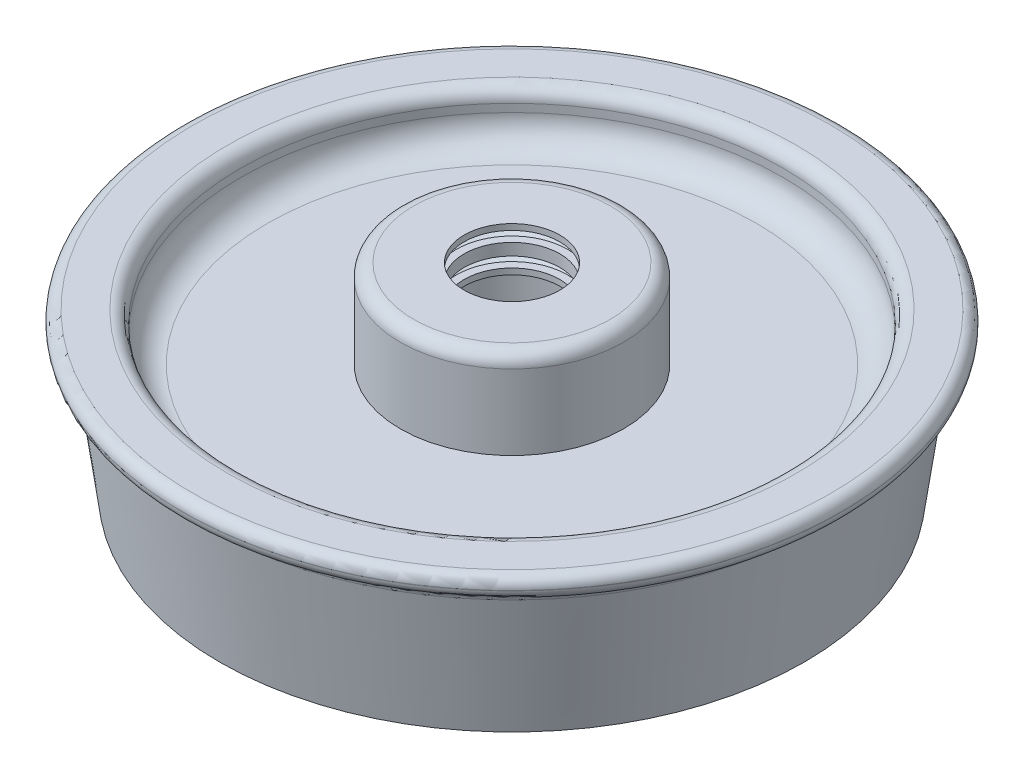
ISO-10303-21;
HEADER;
FILE_DESCRIPTION(('STEP AP214'),'2;1');
FILE_NAME('part.step','',(''),(''),'','','');
FILE_SCHEMA(('AUTOMOTIVE_DESIGN { 1 0 10303 214 1 1 1 1 }'));
ENDSEC;
DATA;
#1=APPLICATION_CONTEXT('core data for automotive mechanical design processes');
#2=APPLICATION_PROTOCOL_DEFINITION('international standard','automotive_design',2000,#1);
#3=PRODUCT_CONTEXT('',#1,'mechanical');
#4=PRODUCT('Part','Part','',(#3));
#5=PRODUCT_RELATED_PRODUCT_CATEGORY('part','',(#4));
#6=PRODUCT_DEFINITION_FORMATION('','',#4);
#7=PRODUCT_DEFINITION_CONTEXT('part definition',#1,'design');
#8=PRODUCT_DEFINITION('design','',#6,#7);
#9=PRODUCT_DEFINITION_SHAPE('','',#8);
#10=(LENGTH_UNIT() NAMED_UNIT(*) SI_UNIT(.MILLI.,.METRE.));
#11=(NAMED_UNIT(*) PLANE_ANGLE_UNIT() SI_UNIT($,.RADIAN.));
#12=(NAMED_UNIT(*) SI_UNIT($,.STERADIAN.) SOLID_ANGLE_UNIT());
#13=UNCERTAINTY_MEASURE_WITH_UNIT(LENGTH_MEASURE(1.E-05),#10,'distance_accuracy_value','');
#14=(GEOMETRIC_REPRESENTATION_CONTEXT(3) GLOBAL_UNCERTAINTY_ASSIGNED_CONTEXT((#13)) GLOBAL_UNIT_ASSIGNED_CONTEXT((#10,
#11,#12)) REPRESENTATION_CONTEXT('',''));
#15=CARTESIAN_POINT('',(0.,0.,0.));
#16=DIRECTION('',(0.,0.,1.));
#17=DIRECTION('',(1.,0.,0.));
#18=AXIS2_PLACEMENT_3D('',#15,#16,#17);
#19=CARTESIAN_POINT('',(-2.99999999999907,34.,-88.8994605039951));
#20=DIRECTION('',(0.,1.,0.));
#21=DIRECTION('',(1.,0.,0.));
#22=AXIS2_PLACEMENT_3D('',#19,#20,#21);
#23=PLANE('',#22);
#24=DIRECTION('',(1.,0.,0.));
#25=VECTOR('',#24,1.);
#26=CARTESIAN_POINT('',(-2.99999999999956,34.,-42.));
#27=LINE('',#26,#25);
#28=CARTESIAN_POINT('',(-2.99999999999956,34.,-42.));
#29=VERTEX_POINT('',#28);
#30=CARTESIAN_POINT('',(3.00000000000044,34.,-42.));
#31=VERTEX_POINT('',#30);
#32=EDGE_CURVE('E55',#29,#31,#27,.T.);
#33=ORIENTED_EDGE('',*,*,#32,.T.);
#34=DIRECTION('',(0.,0.,1.));
#35=VECTOR('',#34,1.);
#36=CARTESIAN_POINT('',(3.00000000000093,34.,-88.8994605039951));
#37=LINE('',#36,#35);
#38=CARTESIAN_POINT('',(3.00000000000093,34.,-88.8994605039951));
#39=VERTEX_POINT('',#38);
#40=EDGE_CURVE('E86',#39,#31,#37,.T.);
#41=ORIENTED_EDGE('',*,*,#40,.F.);
#42=DIRECTION('',(1.,0.,0.));
#43=VECTOR('',#42,1.);
#44=CARTESIAN_POINT('',(-2.99999999999907,34.,-88.8994605039951));
#45=LINE('',#44,#43);
#46=CARTESIAN_POINT('',(-2.99999999999907,34.,-88.8994605039951));
#47=VERTEX_POINT('',#46);
#48=EDGE_CURVE('E12',#47,#39,#45,.T.);
#49=ORIENTED_EDGE('',*,*,#48,.F.);
#50=DIRECTION('',(0.,0.,1.));
#51=VECTOR('',#50,1.);
#52=CARTESIAN_POINT('',(-2.99999999999907,34.,-88.8994605039951));
#53=LINE('',#52,#51);
#54=EDGE_CURVE('E87',#47,#29,#53,.T.);
#55=ORIENTED_EDGE('',*,*,#54,.T.);
#56=EDGE_LOOP('',(#33,#41,#49,#55));
#57=FACE_BOUND('',#56,.T.);
#58=ADVANCED_FACE('F52',(#57),#23,.T.);
#59=CARTESIAN_POINT('',(-2.99999999999956,24.,-42.));
#60=DIRECTION('',(0.,-0.978015034919325,-0.208534389182582));
#61=DIRECTION('',(0.,0.208534389182582,-0.978015034919325));
#62=AXIS2_PLACEMENT_3D('',#59,#60,#61);
#63=PLANE('',#62);
#64=ORIENTED_EDGE('',*,*,#48,.T.);
#65=DIRECTION('',(0.,0.208534389182582,-0.978015034919324));
#66=VECTOR('',#65,1.);
#67=CARTESIAN_POINT('',(3.00000000000044,24.,-42.));
#68=LINE('',#67,#66);
#69=CARTESIAN_POINT('',(3.00000000000044,24.,-42.));
#70=VERTEX_POINT('',#69);
#71=EDGE_CURVE('E96',#70,#39,#68,.T.);
#72=ORIENTED_EDGE('',*,*,#71,.F.);
#73=DIRECTION('',(1.,0.,0.));
#74=VECTOR('',#73,1.);
#75=CARTESIAN_POINT('',(-2.99999999999956,24.,-42.));
#76=LINE('',#75,#74);
#77=CARTESIAN_POINT('',(-2.99999999999956,24.,-42.));
#78=VERTEX_POINT('',#77);
#79=EDGE_CURVE('E60',#78,#70,#76,.T.);
#80=ORIENTED_EDGE('',*,*,#79,.F.);
#81=DIRECTION('',(0.,0.208534389182582,-0.978015034919324));
#82=VECTOR('',#81,1.);
#83=CARTESIAN_POINT('',(-2.99999999999956,24.,-42.));
#84=LINE('',#83,#82);
#85=EDGE_CURVE('E90',#78,#47,#84,.T.);
#86=ORIENTED_EDGE('',*,*,#85,.T.);
#87=EDGE_LOOP('',(#64,#72,#80,#86));
#88=FACE_BOUND('',#87,.T.);
#89=ADVANCED_FACE('F106',(#88),#63,.T.);
#90=CARTESIAN_POINT('',(-2.99999999999956,34.,-42.));
#91=DIRECTION('',(0.,0.,1.));
#92=DIRECTION('',(1.,0.,0.));
#93=AXIS2_PLACEMENT_3D('',#90,#91,#92);
#94=PLANE('',#93);
#95=ORIENTED_EDGE('',*,*,#79,.T.);
#96=DIRECTION('',(0.,-1.,0.));
#97=VECTOR('',#96,1.);
#98=CARTESIAN_POINT('',(3.00000000000044,34.,-42.));
#99=LINE('',#98,#97);
#100=EDGE_CURVE('E92',#31,#70,#99,.T.);
#101=ORIENTED_EDGE('',*,*,#100,.F.);
#102=ORIENTED_EDGE('',*,*,#32,.F.);
#103=DIRECTION('',(0.,-1.,0.));
#104=VECTOR('',#103,1.);
#105=CARTESIAN_POINT('',(-2.99999999999956,34.,-42.));
#106=LINE('',#105,#104);
#107=EDGE_CURVE('E103',#29,#78,#106,.T.);
#108=ORIENTED_EDGE('',*,*,#107,.T.);
#109=EDGE_LOOP('',(#95,#101,#102,#108));
#110=FACE_BOUND('',#109,.T.);
#111=ADVANCED_FACE('F93',(#110),#94,.T.);
#112=CARTESIAN_POINT('',(-3.,0.,0.));
#113=DIRECTION('',(1.,0.,0.));
#114=DIRECTION('',(0.,0.,-1.));
#115=AXIS2_PLACEMENT_3D('',#112,#113,#114);
#116=PLANE('',#115);
#117=ORIENTED_EDGE('',*,*,#54,.F.);
#118=ORIENTED_EDGE('',*,*,#85,.F.);
#119=ORIENTED_EDGE('',*,*,#107,.F.);
#120=EDGE_LOOP('',(#117,#118,#119));
#121=FACE_BOUND('',#120,.T.);
#122=ADVANCED_FACE('F108',(#121),#116,.F.);
#123=CARTESIAN_POINT('',(3.,0.,0.));
#124=DIRECTION('',(1.,0.,0.));
#125=DIRECTION('',(0.,0.,-1.));
#126=AXIS2_PLACEMENT_3D('',#123,#124,#125);
#127=PLANE('',#126);
#128=ORIENTED_EDGE('',*,*,#40,.T.);
#129=ORIENTED_EDGE('',*,*,#100,.T.);
#130=ORIENTED_EDGE('',*,*,#71,.T.);
#131=EDGE_LOOP('',(#128,#129,#130));
#132=FACE_BOUND('',#131,.T.);
#133=ADVANCED_FACE('F98',(#132),#127,.T.);
#134=CLOSED_SHELL('',(#58,#89,#111,#122,#133));
#135=MANIFOLD_SOLID_BREP('B2',#134);
#136=CARTESIAN_POINT('',(-88.8994605039951,34.,3.));
#137=DIRECTION('',(0.,1.,0.));
#138=DIRECTION('',(0.,0.,-1.));
#139=AXIS2_PLACEMENT_3D('',#136,#137,#138);
#140=PLANE('',#139);
#141=DIRECTION('',(0.,0.,-1.));
#142=VECTOR('',#141,1.);
#143=CARTESIAN_POINT('',(-42.,34.,3.));
#144=LINE('',#143,#142);
#145=CARTESIAN_POINT('',(-42.,34.,3.));
#146=VERTEX_POINT('',#145);
#147=CARTESIAN_POINT('',(-42.,34.,-3.));
#148=VERTEX_POINT('',#147);
#149=EDGE_CURVE('E163',#146,#148,#144,.T.);
#150=ORIENTED_EDGE('',*,*,#149,.T.);
#151=DIRECTION('',(1.,0.,0.));
#152=VECTOR('',#151,1.);
#153=CARTESIAN_POINT('',(-88.8994605039951,34.,-3.));
#154=LINE('',#153,#152);
#155=CARTESIAN_POINT('',(-88.8994605039951,34.,-3.));
#156=VERTEX_POINT('',#155);
#157=EDGE_CURVE('E194',#156,#148,#154,.T.);
#158=ORIENTED_EDGE('',*,*,#157,.F.);
#159=DIRECTION('',(0.,0.,-1.));
#160=VECTOR('',#159,1.);
#161=CARTESIAN_POINT('',(-88.8994605039951,34.,3.));
#162=LINE('',#161,#160);
#163=CARTESIAN_POINT('',(-88.8994605039951,34.,3.));
#164=VERTEX_POINT('',#163);
#165=EDGE_CURVE('E50',#164,#156,#162,.T.);
#166=ORIENTED_EDGE('',*,*,#165,.F.);
#167=DIRECTION('',(1.,0.,0.));
#168=VECTOR('',#167,1.);
#169=CARTESIAN_POINT('',(-88.8994605039951,34.,3.));
#170=LINE('',#169,#168);
#171=EDGE_CURVE('E195',#164,#146,#170,.T.);
#172=ORIENTED_EDGE('',*,*,#171,.T.);
#173=EDGE_LOOP('',(#150,#158,#166,#172));
#174=FACE_BOUND('',#173,.T.);
#175=ADVANCED_FACE('F160',(#174),#140,.T.);
#176=CARTESIAN_POINT('',(-42.,24.,3.));
#177=DIRECTION('',(-0.208534389182582,-0.978015034919325,0.));
#178=DIRECTION('',(-0.978015034919325,0.208534389182582,0.));
#179=AXIS2_PLACEMENT_3D('',#176,#177,#178);
#180=PLANE('',#179);
#181=ORIENTED_EDGE('',*,*,#165,.T.);
#182=DIRECTION('',(-0.978015034919324,0.208534389182582,0.));
#183=VECTOR('',#182,1.);
#184=CARTESIAN_POINT('',(-42.,24.,-3.));
#185=LINE('',#184,#183);
#186=CARTESIAN_POINT('',(-42.,24.,-3.));
#187=VERTEX_POINT('',#186);
#188=EDGE_CURVE('E204',#187,#156,#185,.T.);
#189=ORIENTED_EDGE('',*,*,#188,.F.);
#190=DIRECTION('',(0.,0.,-1.));
#191=VECTOR('',#190,1.);
#192=CARTESIAN_POINT('',(-42.,24.,3.));
#193=LINE('',#192,#191);
#194=CARTESIAN_POINT('',(-42.,24.,3.));
#195=VERTEX_POINT('',#194);
#196=EDGE_CURVE('E168',#195,#187,#193,.T.);
#197=ORIENTED_EDGE('',*,*,#196,.F.);
#198=DIRECTION('',(-0.978015034919324,0.208534389182582,0.));
#199=VECTOR('',#198,1.);
#200=CARTESIAN_POINT('',(-42.,24.,3.));
#201=LINE('',#200,#199);
#202=EDGE_CURVE('E198',#195,#164,#201,.T.);
#203=ORIENTED_EDGE('',*,*,#202,.T.);
#204=EDGE_LOOP('',(#181,#189,#197,#203));
#205=FACE_BOUND('',#204,.T.);
#206=ADVANCED_FACE('F214',(#205),#180,.T.);
#207=CARTESIAN_POINT('',(-42.,34.,3.));
#208=DIRECTION('',(1.,0.,0.));
#209=DIRECTION('',(0.,0.,-1.));
#210=AXIS2_PLACEMENT_3D('',#207,#208,#209);
#211=PLANE('',#210);
#212=ORIENTED_EDGE('',*,*,#196,.T.);
#213=DIRECTION('',(0.,-1.,0.));
#214=VECTOR('',#213,1.);
#215=CARTESIAN_POINT('',(-42.,34.,-3.));
#216=LINE('',#215,#214);
#217=EDGE_CURVE('E200',#148,#187,#216,.T.);
#218=ORIENTED_EDGE('',*,*,#217,.F.);
#219=ORIENTED_EDGE('',*,*,#149,.F.);
#220=DIRECTION('',(0.,-1.,0.));
#221=VECTOR('',#220,1.);
#222=CARTESIAN_POINT('',(-42.,34.,3.));
#223=LINE('',#222,#221);
#224=EDGE_CURVE('E211',#146,#195,#223,.T.);
#225=ORIENTED_EDGE('',*,*,#224,.T.);
#226=EDGE_LOOP('',(#212,#218,#219,#225));
#227=FACE_BOUND('',#226,.T.);
#228=ADVANCED_FACE('F201',(#227),#211,.T.);
#229=CARTESIAN_POINT('',(0.,0.,3.));
#230=DIRECTION('',(0.,0.,-1.));
#231=DIRECTION('',(-1.,0.,0.));
#232=AXIS2_PLACEMENT_3D('',#229,#230,#231);
#233=PLANE('',#232);
#234=ORIENTED_EDGE('',*,*,#171,.F.);
#235=ORIENTED_EDGE('',*,*,#202,.F.);
#236=ORIENTED_EDGE('',*,*,#224,.F.);
#237=EDGE_LOOP('',(#234,#235,#236));
#238=FACE_BOUND('',#237,.T.);
#239=ADVANCED_FACE('F216',(#238),#233,.F.);
#240=CARTESIAN_POINT('',(0.,0.,-3.));
#241=DIRECTION('',(0.,0.,-1.));
#242=DIRECTION('',(-1.,0.,0.));
#243=AXIS2_PLACEMENT_3D('',#240,#241,#242);
#244=PLANE('',#243);
#245=ORIENTED_EDGE('',*,*,#157,.T.);
#246=ORIENTED_EDGE('',*,*,#217,.T.);
#247=ORIENTED_EDGE('',*,*,#188,.T.);
#248=EDGE_LOOP('',(#245,#246,#247));
#249=FACE_BOUND('',#248,.T.);
#250=ADVANCED_FACE('F206',(#249),#244,.T.);
#251=CLOSED_SHELL('',(#175,#206,#228,#239,#250));
#252=MANIFOLD_SOLID_BREP('B6',#251);
#253=CARTESIAN_POINT('',(2.99999999999969,34.,88.8994605039951));
#254=DIRECTION('',(0.,1.,0.));
#255=DIRECTION('',(-1.,0.,0.));
#256=AXIS2_PLACEMENT_3D('',#253,#254,#255);
#257=PLANE('',#256);
#258=DIRECTION('',(-1.,0.,0.));
#259=VECTOR('',#258,1.);
#260=CARTESIAN_POINT('',(2.99999999999985,34.,42.));
#261=LINE('',#260,#259);
#262=CARTESIAN_POINT('',(2.99999999999985,34.,42.));
#263=VERTEX_POINT('',#262);
#264=CARTESIAN_POINT('',(-3.00000000000015,34.,42.));
#265=VERTEX_POINT('',#264);
#266=EDGE_CURVE('E271',#263,#265,#261,.T.);
#267=ORIENTED_EDGE('',*,*,#266,.T.);
#268=DIRECTION('',(0.,0.,-1.));
#269=VECTOR('',#268,1.);
#270=CARTESIAN_POINT('',(-3.00000000000031,34.,88.8994605039951));
#271=LINE('',#270,#269);
#272=CARTESIAN_POINT('',(-3.00000000000031,34.,88.8994605039951));
#273=VERTEX_POINT('',#272);
#274=EDGE_CURVE('E302',#273,#265,#271,.T.);
#275=ORIENTED_EDGE('',*,*,#274,.F.);
#276=DIRECTION('',(-1.,0.,0.));
#277=VECTOR('',#276,1.);
#278=CARTESIAN_POINT('',(2.99999999999969,34.,88.8994605039951));
#279=LINE('',#278,#277);
#280=CARTESIAN_POINT('',(2.99999999999969,34.,88.8994605039951));
#281=VERTEX_POINT('',#280);
#282=EDGE_CURVE('E158',#281,#273,#279,.T.);
#283=ORIENTED_EDGE('',*,*,#282,.F.);
#284=DIRECTION('',(0.,0.,-1.));
#285=VECTOR('',#284,1.);
#286=CARTESIAN_POINT('',(2.99999999999969,34.,88.8994605039951));
#287=LINE('',#286,#285);
#288=EDGE_CURVE('E303',#281,#263,#287,.T.);
#289=ORIENTED_EDGE('',*,*,#288,.T.);
#290=EDGE_LOOP('',(#267,#275,#283,#289));
#291=FACE_BOUND('',#290,.T.);
#292=ADVANCED_FACE('F268',(#291),#257,.T.);
#293=CARTESIAN_POINT('',(2.99999999999985,24.,42.));
#294=DIRECTION('',(0.,-0.978015034919325,0.208534389182582));
#295=DIRECTION('',(0.,0.208534389182582,0.978015034919325));
#296=AXIS2_PLACEMENT_3D('',#293,#294,#295);
#297=PLANE('',#296);
#298=ORIENTED_EDGE('',*,*,#282,.T.);
#299=DIRECTION('',(0.,0.208534389182582,0.978015034919324));
#300=VECTOR('',#299,1.);
#301=CARTESIAN_POINT('',(-3.00000000000015,24.,42.));
#302=LINE('',#301,#300);
#303=CARTESIAN_POINT('',(-3.00000000000015,24.,42.));
#304=VERTEX_POINT('',#303);
#305=EDGE_CURVE('E312',#304,#273,#302,.T.);
#306=ORIENTED_EDGE('',*,*,#305,.F.);
#307=DIRECTION('',(-1.,0.,0.));
#308=VECTOR('',#307,1.);
#309=CARTESIAN_POINT('',(2.99999999999985,24.,42.));
#310=LINE('',#309,#308);
#311=CARTESIAN_POINT('',(2.99999999999985,24.,42.));
#312=VERTEX_POINT('',#311);
#313=EDGE_CURVE('E276',#312,#304,#310,.T.);
#314=ORIENTED_EDGE('',*,*,#313,.F.);
#315=DIRECTION('',(0.,0.208534389182582,0.978015034919324));
#316=VECTOR('',#315,1.);
#317=CARTESIAN_POINT('',(2.99999999999985,24.,42.));
#318=LINE('',#317,#316);
#319=EDGE_CURVE('E306',#312,#281,#318,.T.);
#320=ORIENTED_EDGE('',*,*,#319,.T.);
#321=EDGE_LOOP('',(#298,#306,#314,#320));
#322=FACE_BOUND('',#321,.T.);
#323=ADVANCED_FACE('F322',(#322),#297,.T.);
#324=CARTESIAN_POINT('',(2.99999999999985,34.,42.));
#325=DIRECTION('',(0.,0.,-1.));
#326=DIRECTION('',(-1.,0.,0.));
#327=AXIS2_PLACEMENT_3D('',#324,#325,#326);
#328=PLANE('',#327);
#329=ORIENTED_EDGE('',*,*,#313,.T.);
#330=DIRECTION('',(0.,-1.,0.));
#331=VECTOR('',#330,1.);
#332=CARTESIAN_POINT('',(-3.00000000000015,34.,42.));
#333=LINE('',#332,#331);
#334=EDGE_CURVE('E308',#265,#304,#333,.T.);
#335=ORIENTED_EDGE('',*,*,#334,.F.);
#336=ORIENTED_EDGE('',*,*,#266,.F.);
#337=DIRECTION('',(0.,-1.,0.));
#338=VECTOR('',#337,1.);
#339=CARTESIAN_POINT('',(2.99999999999985,34.,42.));
#340=LINE('',#339,#338);
#341=EDGE_CURVE('E319',#263,#312,#340,.T.);
#342=ORIENTED_EDGE('',*,*,#341,.T.);
#343=EDGE_LOOP('',(#329,#335,#336,#342));
#344=FACE_BOUND('',#343,.T.);
#345=ADVANCED_FACE('F309',(#344),#328,.T.);
#346=CARTESIAN_POINT('',(3.,0.,0.));
#347=DIRECTION('',(-1.,0.,0.));
#348=DIRECTION('',(0.,0.,1.));
#349=AXIS2_PLACEMENT_3D('',#346,#347,#348);
#350=PLANE('',#349);
#351=ORIENTED_EDGE('',*,*,#288,.F.);
#352=ORIENTED_EDGE('',*,*,#319,.F.);
#353=ORIENTED_EDGE('',*,*,#341,.F.);
#354=EDGE_LOOP('',(#351,#352,#353));
#355=FACE_BOUND('',#354,.T.);
#356=ADVANCED_FACE('F324',(#355),#350,.F.);
#357=CARTESIAN_POINT('',(-3.,0.,0.));
#358=DIRECTION('',(-1.,0.,0.));
#359=DIRECTION('',(0.,0.,1.));
#360=AXIS2_PLACEMENT_3D('',#357,#358,#359);
#361=PLANE('',#360);
#362=ORIENTED_EDGE('',*,*,#274,.T.);
#363=ORIENTED_EDGE('',*,*,#334,.T.);
#364=ORIENTED_EDGE('',*,*,#305,.T.);
#365=EDGE_LOOP('',(#362,#363,#364));
#366=FACE_BOUND('',#365,.T.);
#367=ADVANCED_FACE('F314',(#366),#361,.T.);
#368=CLOSED_SHELL('',(#292,#323,#345,#356,#367));
#369=MANIFOLD_SOLID_BREP('B44',#368);
#370=CARTESIAN_POINT('',(88.8994605039951,34.,-3.));
#371=DIRECTION('',(0.,1.,0.));
#372=DIRECTION('',(0.,0.,1.));
#373=AXIS2_PLACEMENT_3D('',#370,#371,#372);
#374=PLANE('',#373);
#375=DIRECTION('',(0.,0.,1.));
#376=VECTOR('',#375,1.);
#377=CARTESIAN_POINT('',(42.,34.,-3.));
#378=LINE('',#377,#376);
#379=CARTESIAN_POINT('',(42.,34.,-3.));
#380=VERTEX_POINT('',#379);
#381=CARTESIAN_POINT('',(42.,34.,3.));
#382=VERTEX_POINT('',#381);
#383=EDGE_CURVE('E376',#380,#382,#378,.T.);
#384=ORIENTED_EDGE('',*,*,#383,.T.);
#385=DIRECTION('',(-1.,0.,0.));
#386=VECTOR('',#385,1.);
#387=CARTESIAN_POINT('',(88.8994605039951,34.,3.));
#388=LINE('',#387,#386);
#389=CARTESIAN_POINT('',(88.8994605039951,34.,3.));
#390=VERTEX_POINT('',#389);
#391=EDGE_CURVE('E407',#390,#382,#388,.T.);
#392=ORIENTED_EDGE('',*,*,#391,.F.);
#393=DIRECTION('',(0.,0.,1.));
#394=VECTOR('',#393,1.);
#395=CARTESIAN_POINT('',(88.8994605039951,34.,-3.));
#396=LINE('',#395,#394);
#397=CARTESIAN_POINT('',(88.8994605039951,34.,-3.));
#398=VERTEX_POINT('',#397);
#399=EDGE_CURVE('E266',#398,#390,#396,.T.);
#400=ORIENTED_EDGE('',*,*,#399,.F.);
#401=DIRECTION('',(-1.,0.,0.));
#402=VECTOR('',#401,1.);
#403=CARTESIAN_POINT('',(88.8994605039951,34.,-3.));
#404=LINE('',#403,#402);
#405=EDGE_CURVE('E408',#398,#380,#404,.T.);
#406=ORIENTED_EDGE('',*,*,#405,.T.);
#407=EDGE_LOOP('',(#384,#392,#400,#406));
#408=FACE_BOUND('',#407,.T.);
#409=ADVANCED_FACE('F373',(#408),#374,.T.);
#410=CARTESIAN_POINT('',(42.,24.,-3.));
#411=DIRECTION('',(0.208534389182582,-0.978015034919325,0.));
#412=DIRECTION('',(0.978015034919325,0.208534389182582,0.));
#413=AXIS2_PLACEMENT_3D('',#410,#411,#412);
#414=PLANE('',#413);
#415=ORIENTED_EDGE('',*,*,#399,.T.);
#416=DIRECTION('',(0.978015034919324,0.208534389182582,0.));
#417=VECTOR('',#416,1.);
#418=CARTESIAN_POINT('',(42.,24.,3.));
#419=LINE('',#418,#417);
#420=CARTESIAN_POINT('',(42.,24.,3.));
#421=VERTEX_POINT('',#420);
#422=EDGE_CURVE('E417',#421,#390,#419,.T.);
#423=ORIENTED_EDGE('',*,*,#422,.F.);
#424=DIRECTION('',(0.,0.,1.));
#425=VECTOR('',#424,1.);
#426=CARTESIAN_POINT('',(42.,24.,-3.));
#427=LINE('',#426,#425);
#428=CARTESIAN_POINT('',(42.,24.,-3.));
#429=VERTEX_POINT('',#428);
#430=EDGE_CURVE('E381',#429,#421,#427,.T.);
#431=ORIENTED_EDGE('',*,*,#430,.F.);
#432=DIRECTION('',(0.978015034919324,0.208534389182582,0.));
#433=VECTOR('',#432,1.);
#434=CARTESIAN_POINT('',(42.,24.,-3.));
#435=LINE('',#434,#433);
#436=EDGE_CURVE('E411',#429,#398,#435,.T.);
#437=ORIENTED_EDGE('',*,*,#436,.T.);
#438=EDGE_LOOP('',(#415,#423,#431,#437));
#439=FACE_BOUND('',#438,.T.);
#440=ADVANCED_FACE('F427',(#439),#414,.T.);
#441=CARTESIAN_POINT('',(42.,34.,-3.));
#442=DIRECTION('',(-1.,0.,0.));
#443=DIRECTION('',(0.,0.,1.));
#444=AXIS2_PLACEMENT_3D('',#441,#442,#443);
#445=PLANE('',#444);
#446=ORIENTED_EDGE('',*,*,#430,.T.);
#447=DIRECTION('',(0.,-1.,0.));
#448=VECTOR('',#447,1.);
#449=CARTESIAN_POINT('',(42.,34.,3.));
#450=LINE('',#449,#448);
#451=EDGE_CURVE('E413',#382,#421,#450,.T.);
#452=ORIENTED_EDGE('',*,*,#451,.F.);
#453=ORIENTED_EDGE('',*,*,#383,.F.);
#454=DIRECTION('',(0.,-1.,0.));
#455=VECTOR('',#454,1.);
#456=CARTESIAN_POINT('',(42.,34.,-3.));
#457=LINE('',#456,#455);
#458=EDGE_CURVE('E424',#380,#429,#457,.T.);
#459=ORIENTED_EDGE('',*,*,#458,.T.);
#460=EDGE_LOOP('',(#446,#452,#453,#459));
#461=FACE_BOUND('',#460,.T.);
#462=ADVANCED_FACE('F414',(#461),#445,.T.);
#463=CARTESIAN_POINT('',(0.,0.,-3.));
#464=DIRECTION('',(0.,0.,1.));
#465=DIRECTION('',(1.,0.,0.));
#466=AXIS2_PLACEMENT_3D('',#463,#464,#465);
#467=PLANE('',#466);
#468=ORIENTED_EDGE('',*,*,#405,.F.);
#469=ORIENTED_EDGE('',*,*,#436,.F.);
#470=ORIENTED_EDGE('',*,*,#458,.F.);
#471=EDGE_LOOP('',(#468,#469,#470));
#472=FACE_BOUND('',#471,.T.);
#473=ADVANCED_FACE('F429',(#472),#467,.F.);
#474=CARTESIAN_POINT('',(0.,0.,3.));
#475=DIRECTION('',(0.,0.,1.));
#476=DIRECTION('',(1.,0.,0.));
#477=AXIS2_PLACEMENT_3D('',#474,#475,#476);
#478=PLANE('',#477);
#479=ORIENTED_EDGE('',*,*,#391,.T.);
#480=ORIENTED_EDGE('',*,*,#451,.T.);
#481=ORIENTED_EDGE('',*,*,#422,.T.);
#482=EDGE_LOOP('',(#479,#480,#481));
#483=FACE_BOUND('',#482,.T.);
#484=ADVANCED_FACE('F419',(#483),#478,.T.);
#485=CLOSED_SHELL('',(#409,#440,#462,#473,#484));
#486=MANIFOLD_SOLID_BREP('B152',#485);
#487=CARTESIAN_POINT('',(0.,0.,0.));
#488=DIRECTION('',(0.,-1.,0.));
#489=DIRECTION('',(0.,0.,-1.));
#490=AXIS2_PLACEMENT_3D('',#487,#488,#489);
#491=CYLINDRICAL_SURFACE('',#490,18.);
#492=CARTESIAN_POINT('',(0.,72.9648373031406,0.));
#493=DIRECTION('',(0.,1.,0.));
#494=DIRECTION('',(0.,0.,1.));
#495=AXIS2_PLACEMENT_3D('',#492,#493,#494);
#496=CIRCLE('',#495,18.);
#497=CARTESIAN_POINT('',(0.,72.9648373031406,18.));
#498=VERTEX_POINT('',#497);
#499=EDGE_CURVE('E475',#498,#498,#496,.F.);
#500=ORIENTED_EDGE('',*,*,#499,.T.);
#501=EDGE_LOOP('',(#500));
#502=FACE_BOUND('',#501,.T.);
#503=CARTESIAN_POINT('',(0.,75.1956504911902,0.));
#504=DIRECTION('',(0.,-1.,0.));
#505=DIRECTION('',(0.,0.,-1.));
#506=AXIS2_PLACEMENT_3D('',#503,#504,#505);
#507=CIRCLE('',#506,18.);
#508=CARTESIAN_POINT('',(0.,75.1956504911902,-18.));
#509=VERTEX_POINT('',#508);
#510=EDGE_CURVE('E524',#509,#509,#507,.T.);
#511=ORIENTED_EDGE('',*,*,#510,.F.);
#512=EDGE_LOOP('',(#511));
#513=FACE_BOUND('',#512,.T.);
#514=ADVANCED_FACE('F471',(#502,#513),#491,.F.);
#515=CARTESIAN_POINT('',(0.,60.7217976623304,0.));
#516=DIRECTION('',(0.,-1.,0.));
#517=DIRECTION('',(0.,0.,-1.));
#518=AXIS2_PLACEMENT_3D('',#515,#516,#517);
#519=CIRCLE('',#518,18.);
#520=CARTESIAN_POINT('',(0.,60.7217976623304,-18.));
#521=VERTEX_POINT('',#520);
#522=EDGE_CURVE('E491',#521,#521,#519,.F.);
#523=ORIENTED_EDGE('',*,*,#522,.T.);
#524=EDGE_LOOP('',(#523));
#525=FACE_BOUND('',#524,.T.);
#526=CARTESIAN_POINT('',(0.,58.4909844742809,0.));
#527=DIRECTION('',(0.,-1.,0.));
#528=DIRECTION('',(0.,0.,-1.));
#529=AXIS2_PLACEMENT_3D('',#526,#527,#528);
#530=CIRCLE('',#529,18.);
#531=CARTESIAN_POINT('',(0.,58.4909844742809,-18.));
#532=VERTEX_POINT('',#531);
#533=EDGE_CURVE('E527',#532,#532,#530,.T.);
#534=ORIENTED_EDGE('',*,*,#533,.T.);
#535=EDGE_LOOP('',(#534));
#536=FACE_BOUND('',#535,.T.);
#537=ADVANCED_FACE('F608',(#525,#536),#491,.F.);
#538=CARTESIAN_POINT('',(-124.,60.,0.));
#539=DIRECTION('',(0.,-1.,0.));
#540=DIRECTION('',(0.,0.,-1.));
#541=AXIS2_PLACEMENT_3D('',#538,#539,#540);
#542=PLANE('',#541);
#543=CARTESIAN_POINT('',(0.,60.,0.));
#544=DIRECTION('',(0.,-1.,0.));
#545=DIRECTION('',(0.,0.,-1.));
#546=AXIS2_PLACEMENT_3D('',#543,#544,#545);
#547=CIRCLE('',#546,120.);
#548=CARTESIAN_POINT('',(0.,60.,-120.));
#549=VERTEX_POINT('',#548);
#550=EDGE_CURVE('E566',#549,#549,#547,.F.);
#551=ORIENTED_EDGE('',*,*,#550,.T.);
#552=EDGE_LOOP('',(#551));
#553=FACE_BOUND('',#552,.T.);
#554=CARTESIAN_POINT('',(0.,60.,0.));
#555=DIRECTION('',(0.,-1.,0.));
#556=DIRECTION('',(0.,0.,-1.));
#557=AXIS2_PLACEMENT_3D('',#554,#555,#556);
#558=CIRCLE('',#557,107.);
#559=CARTESIAN_POINT('',(0.,60.,-107.));
#560=VERTEX_POINT('',#559);
#561=EDGE_CURVE('E548',#560,#560,#558,.T.);
#562=ORIENTED_EDGE('',*,*,#561,.T.);
#563=EDGE_LOOP('',(#562));
#564=FACE_BOUND('',#563,.T.);
#565=ADVANCED_FACE('F617',(#553,#564),#542,.F.);
#566=CARTESIAN_POINT('',(0.,0.,0.));
#567=DIRECTION('',(0.,-1.,0.));
#568=DIRECTION('',(0.,0.,-1.));
#569=AXIS2_PLACEMENT_3D('',#566,#567,#568);
#570=CYLINDRICAL_SURFACE('',#569,124.);
#571=CARTESIAN_POINT('',(0.,55.8675262076911,0.));
#572=DIRECTION('',(0.,1.,0.));
#573=DIRECTION('',(0.,0.,1.));
#574=AXIS2_PLACEMENT_3D('',#571,#572,#573);
#575=CIRCLE('',#574,124.);
#576=CARTESIAN_POINT('',(0.,55.8675262076911,124.));
#577=VERTEX_POINT('',#576);
#578=EDGE_CURVE('E572',#577,#577,#575,.T.);
#579=ORIENTED_EDGE('',*,*,#578,.T.);
#580=EDGE_LOOP('',(#579));
#581=FACE_BOUND('',#580,.T.);
#582=CARTESIAN_POINT('',(0.,56.,0.));
#583=DIRECTION('',(0.,-1.,0.));
#584=DIRECTION('',(0.,0.,-1.));
#585=AXIS2_PLACEMENT_3D('',#582,#583,#584);
#586=CIRCLE('',#585,124.);
#587=CARTESIAN_POINT('',(0.,56.,-124.));
#588=VERTEX_POINT('',#587);
#589=EDGE_CURVE('E563',#588,#588,#586,.T.);
#590=ORIENTED_EDGE('',*,*,#589,.T.);
#591=EDGE_LOOP('',(#590));
#592=FACE_BOUND('',#591,.T.);
#593=ADVANCED_FACE('F706',(#581,#592),#570,.T.);
#594=CARTESIAN_POINT('',(0.,51.9999999999999,0.));
#595=DIRECTION('',(0.,1.,0.));
#596=DIRECTION('',(0.,0.,1.));
#597=AXIS2_PLACEMENT_3D('',#594,#595,#596);
#598=CONICAL_SURFACE('',#597,117.181576325995,0.137239083077545);
#599=CARTESIAN_POINT('',(0.,47.6840434108599,0.));
#600=DIRECTION('',(0.,1.,0.));
#601=DIRECTION('',(0.,0.,1.));
#602=AXIS2_PLACEMENT_3D('',#599,#600,#601);
#603=CIRCLE('',#602,116.585511486292);
#604=CARTESIAN_POINT('',(0.,47.6840434108599,116.585511486292));
#605=VERTEX_POINT('',#604);
#606=EDGE_CURVE('E560',#605,#605,#603,.F.);
#607=ORIENTED_EDGE('',*,*,#606,.T.);
#608=EDGE_LOOP('',(#607));
#609=FACE_BOUND('',#608,.T.);
#610=CARTESIAN_POINT('',(0.,0.,0.));
#611=DIRECTION('',(0.,-1.,0.));
#612=DIRECTION('',(0.,0.,-1.));
#613=AXIS2_PLACEMENT_3D('',#610,#611,#612);
#614=CIRCLE('',#613,110.);
#615=CARTESIAN_POINT('',(0.,0.,-110.));
#616=VERTEX_POINT('',#615);
#617=EDGE_CURVE('E545',#616,#616,#614,.T.);
#618=ORIENTED_EDGE('',*,*,#617,.F.);
#619=EDGE_LOOP('',(#618));
#620=FACE_BOUND('',#619,.T.);
#621=ADVANCED_FACE('F702',(#609,#620),#598,.T.);
#622=CARTESIAN_POINT('',(-110.,0.,0.));
#623=DIRECTION('',(0.,1.,0.));
#624=DIRECTION('',(0.,0.,1.));
#625=AXIS2_PLACEMENT_3D('',#622,#623,#624);
#626=PLANE('',#625);
#627=CARTESIAN_POINT('',(0.,0.,0.));
#628=DIRECTION('',(0.,-1.,0.));
#629=DIRECTION('',(0.,0.,-1.));
#630=AXIS2_PLACEMENT_3D('',#627,#628,#629);
#631=CIRCLE('',#630,102.);
#632=CARTESIAN_POINT('',(0.,0.,-102.));
#633=VERTEX_POINT('',#632);
#634=EDGE_CURVE('E542',#633,#633,#631,.T.);
#635=ORIENTED_EDGE('',*,*,#634,.F.);
#636=EDGE_LOOP('',(#635));
#637=FACE_BOUND('',#636,.T.);
#638=ORIENTED_EDGE('',*,*,#617,.T.);
#639=EDGE_LOOP('',(#638));
#640=FACE_BOUND('',#639,.T.);
#641=ADVANCED_FACE('F697',(#637,#640),#626,.F.);
#642=CARTESIAN_POINT('',(0.,0.,0.));
#643=DIRECTION('',(0.,-1.,0.));
#644=DIRECTION('',(0.,0.,-1.));
#645=AXIS2_PLACEMENT_3D('',#642,#643,#644);
#646=CYLINDRICAL_SURFACE('',#645,102.);
#647=CARTESIAN_POINT('',(0.,24.,0.));
#648=DIRECTION('',(0.,1.,0.));
#649=DIRECTION('',(0.,0.,1.));
#650=AXIS2_PLACEMENT_3D('',#647,#648,#649);
#651=CIRCLE('',#650,102.);
#652=CARTESIAN_POINT('',(0.,24.,102.));
#653=VERTEX_POINT('',#652);
#654=EDGE_CURVE('E372',#653,#653,#651,.T.);
#655=ORIENTED_EDGE('',*,*,#654,.T.);
#656=EDGE_LOOP('',(#655));
#657=FACE_BOUND('',#656,.T.);
#658=ORIENTED_EDGE('',*,*,#634,.T.);
#659=EDGE_LOOP('',(#658));
#660=FACE_BOUND('',#659,.T.);
#661=ADVANCED_FACE('F690',(#657,#660),#646,.F.);
#662=CARTESIAN_POINT('',(-102.,34.,0.));
#663=DIRECTION('',(0.,1.,0.));
#664=DIRECTION('',(0.,0.,1.));
#665=AXIS2_PLACEMENT_3D('',#662,#663,#664);
#666=PLANE('',#665);
#667=CARTESIAN_POINT('',(0.,34.,0.));
#668=DIRECTION('',(0.,1.,0.));
#669=DIRECTION('',(0.,0.,1.));
#670=AXIS2_PLACEMENT_3D('',#667,#668,#669);
#671=CIRCLE('',#670,92.);
#672=CARTESIAN_POINT('',(0.,34.,92.));
#673=VERTEX_POINT('',#672);
#674=EDGE_CURVE('E479',#673,#673,#671,.F.);
#675=ORIENTED_EDGE('',*,*,#674,.T.);
#676=EDGE_LOOP('',(#675));
#677=FACE_BOUND('',#676,.T.);
#678=CARTESIAN_POINT('',(0.,34.,0.));
#679=DIRECTION('',(0.,-1.,0.));
#680=DIRECTION('',(0.,0.,-1.));
#681=AXIS2_PLACEMENT_3D('',#678,#679,#680);
#682=CIRCLE('',#681,42.);
#683=CARTESIAN_POINT('',(0.,34.,-42.));
#684=VERTEX_POINT('',#683);
#685=EDGE_CURVE('E539',#684,#684,#682,.T.);
#686=ORIENTED_EDGE('',*,*,#685,.F.);
#687=EDGE_LOOP('',(#686));
#688=FACE_BOUND('',#687,.T.);
#689=ADVANCED_FACE('F685',(#677,#688),#666,.F.);
#690=CARTESIAN_POINT('',(0.,0.,0.));
#691=DIRECTION('',(0.,-1.,0.));
#692=DIRECTION('',(0.,0.,-1.));
#693=AXIS2_PLACEMENT_3D('',#690,#691,#692);
#694=CYLINDRICAL_SURFACE('',#693,42.);
#695=CARTESIAN_POINT('',(0.,12.,0.));
#696=DIRECTION('',(0.,-1.,0.));
#697=DIRECTION('',(0.,0.,-1.));
#698=AXIS2_PLACEMENT_3D('',#695,#696,#697);
#699=CIRCLE('',#698,42.);
#700=CARTESIAN_POINT('',(0.,12.,-42.));
#701=VERTEX_POINT('',#700);
#702=EDGE_CURVE('E536',#701,#701,#699,.T.);
#703=ORIENTED_EDGE('',*,*,#702,.F.);
#704=EDGE_LOOP('',(#703));
#705=FACE_BOUND('',#704,.T.);
#706=ORIENTED_EDGE('',*,*,#685,.T.);
#707=EDGE_LOOP('',(#706));
#708=FACE_BOUND('',#707,.T.);
#709=ADVANCED_FACE('F679',(#705,#708),#694,.T.);
#710=CARTESIAN_POINT('',(-28.,12.,0.));
#711=DIRECTION('',(0.,1.,0.));
#712=DIRECTION('',(0.,0.,1.));
#713=AXIS2_PLACEMENT_3D('',#710,#711,#712);
#714=PLANE('',#713);
#715=CARTESIAN_POINT('',(0.,12.,0.));
#716=DIRECTION('',(0.,-1.,0.));
#717=DIRECTION('',(0.,0.,-1.));
#718=AXIS2_PLACEMENT_3D('',#715,#716,#717);
#719=CIRCLE('',#718,28.);
#720=CARTESIAN_POINT('',(0.,12.,-28.));
#721=VERTEX_POINT('',#720);
#722=EDGE_CURVE('E533',#721,#721,#719,.T.);
#723=ORIENTED_EDGE('',*,*,#722,.F.);
#724=EDGE_LOOP('',(#723));
#725=FACE_BOUND('',#724,.T.);
#726=ORIENTED_EDGE('',*,*,#702,.T.);
#727=EDGE_LOOP('',(#726));
#728=FACE_BOUND('',#727,.T.);
#729=ADVANCED_FACE('F673',(#725,#728),#714,.F.);
#730=CARTESIAN_POINT('',(0.,0.,0.));
#731=DIRECTION('',(0.,-1.,0.));
#732=DIRECTION('',(0.,0.,-1.));
#733=AXIS2_PLACEMENT_3D('',#730,#731,#732);
#734=CYLINDRICAL_SURFACE('',#733,28.);
#735=CARTESIAN_POINT('',(0.,58.4909844742809,0.));
#736=DIRECTION('',(0.,-1.,0.));
#737=DIRECTION('',(0.,0.,-1.));
#738=AXIS2_PLACEMENT_3D('',#735,#736,#737);
#739=CIRCLE('',#738,28.);
#740=CARTESIAN_POINT('',(0.,58.4909844742809,-28.));
#741=VERTEX_POINT('',#740);
#742=EDGE_CURVE('E530',#741,#741,#739,.T.);
#743=ORIENTED_EDGE('',*,*,#742,.F.);
#744=EDGE_LOOP('',(#743));
#745=FACE_BOUND('',#744,.T.);
#746=ORIENTED_EDGE('',*,*,#722,.T.);
#747=EDGE_LOOP('',(#746));
#748=FACE_BOUND('',#747,.T.);
#749=ADVANCED_FACE('F628',(#745,#748),#734,.F.);
#750=CARTESIAN_POINT('',(-18.,58.4909844742809,0.));
#751=DIRECTION('',(0.,1.,0.));
#752=DIRECTION('',(0.,0.,1.));
#753=AXIS2_PLACEMENT_3D('',#750,#751,#752);
#754=PLANE('',#753);
#755=ORIENTED_EDGE('',*,*,#533,.F.);
#756=EDGE_LOOP('',(#755));
#757=FACE_BOUND('',#756,.T.);
#758=ORIENTED_EDGE('',*,*,#742,.T.);
#759=EDGE_LOOP('',(#758));
#760=FACE_BOUND('',#759,.T.);
#761=ADVANCED_FACE('F622',(#757,#760),#754,.F.);
#762=CARTESIAN_POINT('',(0.,69.0764636792397,0.));
#763=DIRECTION('',(0.,-1.,0.));
#764=DIRECTION('',(0.,0.,-1.));
#765=AXIS2_PLACEMENT_3D('',#762,#763,#764);
#766=CIRCLE('',#765,18.);
#767=CARTESIAN_POINT('',(0.,69.0764636792397,-18.));
#768=VERTEX_POINT('',#767);
#769=EDGE_CURVE('E495',#768,#768,#766,.F.);
#770=ORIENTED_EDGE('',*,*,#769,.T.);
#771=EDGE_LOOP('',(#770));
#772=FACE_BOUND('',#771,.T.);
#773=CARTESIAN_POINT('',(0.,64.6101712862313,0.));
#774=DIRECTION('',(0.,1.,0.));
#775=DIRECTION('',(0.,0.,1.));
#776=AXIS2_PLACEMENT_3D('',#773,#774,#775);
#777=CIRCLE('',#776,18.);
#778=CARTESIAN_POINT('',(0.,64.6101712862313,18.));
#779=VERTEX_POINT('',#778);
#780=EDGE_CURVE('E488',#779,#779,#777,.F.);
#781=ORIENTED_EDGE('',*,*,#780,.T.);
#782=EDGE_LOOP('',(#781));
#783=FACE_BOUND('',#782,.T.);
#784=ADVANCED_FACE('F611',(#772,#783),#491,.F.);
#785=CARTESIAN_POINT('',(-42.,75.1956504911902,0.));
#786=DIRECTION('',(0.,-1.,0.));
#787=DIRECTION('',(0.,0.,-1.));
#788=AXIS2_PLACEMENT_3D('',#785,#786,#787);
#789=PLANE('',#788);
#790=CARTESIAN_POINT('',(0.,75.1956504911902,0.));
#791=DIRECTION('',(0.,-1.,0.));
#792=DIRECTION('',(0.,0.,-1.));
#793=AXIS2_PLACEMENT_3D('',#790,#791,#792);
#794=CIRCLE('',#793,37.);
#795=CARTESIAN_POINT('',(0.,75.1956504911902,-37.));
#796=VERTEX_POINT('',#795);
#797=EDGE_CURVE('E484',#796,#796,#794,.F.);
#798=ORIENTED_EDGE('',*,*,#797,.T.);
#799=EDGE_LOOP('',(#798));
#800=FACE_BOUND('',#799,.T.);
#801=ORIENTED_EDGE('',*,*,#510,.T.);
#802=EDGE_LOOP('',(#801));
#803=FACE_BOUND('',#802,.T.);
#804=ADVANCED_FACE('F580',(#800,#803),#789,.F.);
#805=CARTESIAN_POINT('',(0.,0.,0.));
#806=DIRECTION('',(0.,-1.,0.));
#807=DIRECTION('',(0.,0.,-1.));
#808=AXIS2_PLACEMENT_3D('',#805,#806,#807);
#809=CYLINDRICAL_SURFACE('',#808,42.);
#810=CARTESIAN_POINT('',(0.,70.1956504911901,0.));
#811=DIRECTION('',(0.,-1.,0.));
#812=DIRECTION('',(0.,0.,-1.));
#813=AXIS2_PLACEMENT_3D('',#810,#811,#812);
#814=CIRCLE('',#813,42.);
#815=CARTESIAN_POINT('',(0.,70.1956504911901,-42.));
#816=VERTEX_POINT('',#815);
#817=EDGE_CURVE('E575',#816,#816,#814,.T.);
#818=ORIENTED_EDGE('',*,*,#817,.T.);
#819=EDGE_LOOP('',(#818));
#820=FACE_BOUND('',#819,.T.);
#821=CARTESIAN_POINT('',(0.,42.,0.));
#822=DIRECTION('',(0.,-1.,0.));
#823=DIRECTION('',(0.,0.,-1.));
#824=AXIS2_PLACEMENT_3D('',#821,#822,#823);
#825=CIRCLE('',#824,42.);
#826=CARTESIAN_POINT('',(0.,42.,-42.));
#827=VERTEX_POINT('',#826);
#828=EDGE_CURVE('E494',#827,#827,#825,.T.);
#829=ORIENTED_EDGE('',*,*,#828,.F.);
#830=EDGE_LOOP('',(#829));
#831=FACE_BOUND('',#830,.T.);
#832=ADVANCED_FACE('F589',(#820,#831),#809,.T.);
#833=CARTESIAN_POINT('',(-102.,42.,0.));
#834=DIRECTION('',(0.,-1.,0.));
#835=DIRECTION('',(0.,0.,-1.));
#836=AXIS2_PLACEMENT_3D('',#833,#834,#835);
#837=PLANE('',#836);
#838=CARTESIAN_POINT('',(0.,42.,0.));
#839=DIRECTION('',(0.,-1.,0.));
#840=DIRECTION('',(0.,0.,-1.));
#841=AXIS2_PLACEMENT_3D('',#838,#839,#840);
#842=CIRCLE('',#841,92.);
#843=CARTESIAN_POINT('',(0.,42.,-92.));
#844=VERTEX_POINT('',#843);
#845=EDGE_CURVE('E557',#844,#844,#842,.F.);
#846=ORIENTED_EDGE('',*,*,#845,.T.);
#847=EDGE_LOOP('',(#846));
#848=FACE_BOUND('',#847,.T.);
#849=ORIENTED_EDGE('',*,*,#828,.T.);
#850=EDGE_LOOP('',(#849));
#851=FACE_BOUND('',#850,.T.);
#852=ADVANCED_FACE('F592',(#848,#851),#837,.F.);
#853=CARTESIAN_POINT('',(0.,0.,0.));
#854=DIRECTION('',(0.,-1.,0.));
#855=DIRECTION('',(0.,0.,-1.));
#856=AXIS2_PLACEMENT_3D('',#853,#854,#855);
#857=CYLINDRICAL_SURFACE('',#856,102.);
#858=CARTESIAN_POINT('',(0.,52.,0.));
#859=DIRECTION('',(0.,-1.,0.));
#860=DIRECTION('',(0.,0.,-1.));
#861=AXIS2_PLACEMENT_3D('',#858,#859,#860);
#862=CIRCLE('',#861,102.);
#863=CARTESIAN_POINT('',(0.,52.,-102.));
#864=VERTEX_POINT('',#863);
#865=EDGE_CURVE('E554',#864,#864,#862,.T.);
#866=ORIENTED_EDGE('',*,*,#865,.T.);
#867=EDGE_LOOP('',(#866));
#868=FACE_BOUND('',#867,.T.);
#869=CARTESIAN_POINT('',(0.,55.,0.));
#870=DIRECTION('',(0.,-1.,0.));
#871=DIRECTION('',(0.,0.,-1.));
#872=AXIS2_PLACEMENT_3D('',#869,#870,#871);
#873=CIRCLE('',#872,102.);
#874=CARTESIAN_POINT('',(0.,55.,-102.));
#875=VERTEX_POINT('',#874);
#876=EDGE_CURVE('E551',#875,#875,#873,.F.);
#877=ORIENTED_EDGE('',*,*,#876,.T.);
#878=EDGE_LOOP('',(#877));
#879=FACE_BOUND('',#878,.T.);
#880=ADVANCED_FACE('F597',(#868,#879),#857,.F.);
#881=CARTESIAN_POINT('',(0.,55.,0.));
#882=DIRECTION('',(0.,-1.,0.));
#883=DIRECTION('',(0.,0.,-1.));
#884=AXIS2_PLACEMENT_3D('',#881,#882,#883);
#885=TOROIDAL_SURFACE('',#884,107.,5.);
#886=ORIENTED_EDGE('',*,*,#876,.F.);
#887=EDGE_LOOP('',(#886));
#888=FACE_BOUND('',#887,.T.);
#889=ORIENTED_EDGE('',*,*,#561,.F.);
#890=EDGE_LOOP('',(#889));
#891=FACE_BOUND('',#890,.T.);
#892=ADVANCED_FACE('F604',(#888,#891),#885,.T.);
#893=CARTESIAN_POINT('',(0.,52.,0.));
#894=DIRECTION('',(0.,-1.,0.));
#895=DIRECTION('',(0.,0.,-1.));
#896=AXIS2_PLACEMENT_3D('',#893,#894,#895);
#897=TOROIDAL_SURFACE('',#896,92.,10.);
#898=ORIENTED_EDGE('',*,*,#845,.F.);
#899=EDGE_LOOP('',(#898));
#900=FACE_BOUND('',#899,.T.);
#901=ORIENTED_EDGE('',*,*,#865,.F.);
#902=EDGE_LOOP('',(#901));
#903=FACE_BOUND('',#902,.T.);
#904=ADVANCED_FACE('F715',(#900,#903),#897,.F.);
#905=CARTESIAN_POINT('',(0.,46.9999999999999,0.));
#906=DIRECTION('',(0.,1.,0.));
#907=DIRECTION('',(0.,0.,1.));
#908=AXIS2_PLACEMENT_3D('',#905,#906,#907);
#909=TOROIDAL_SURFACE('',#908,121.538498929447,5.);
#910=CARTESIAN_POINT('',(0.,51.9264034486999,0.));
#911=DIRECTION('',(0.,-1.,0.));
#912=DIRECTION('',(0.,0.,-1.));
#913=AXIS2_PLACEMENT_3D('',#910,#911,#912);
#914=CIRCLE('',#913,120.68377730198);
#915=CARTESIAN_POINT('',(0.,51.9264034486999,-120.68377730198));
#916=VERTEX_POINT('',#915);
#917=EDGE_CURVE('E569',#916,#916,#914,.T.);
#918=ORIENTED_EDGE('',*,*,#917,.T.);
#919=EDGE_LOOP('',(#918));
#920=FACE_BOUND('',#919,.T.);
#921=ORIENTED_EDGE('',*,*,#606,.F.);
#922=EDGE_LOOP('',(#921));
#923=FACE_BOUND('',#922,.T.);
#924=ADVANCED_FACE('F719',(#920,#923),#909,.F.);
#925=CARTESIAN_POINT('',(0.,56.,0.));
#926=DIRECTION('',(0.,-1.,0.));
#927=DIRECTION('',(0.,0.,-1.));
#928=AXIS2_PLACEMENT_3D('',#925,#926,#927);
#929=TOROIDAL_SURFACE('',#928,120.,4.);
#930=ORIENTED_EDGE('',*,*,#550,.F.);
#931=EDGE_LOOP('',(#930));
#932=FACE_BOUND('',#931,.T.);
#933=ORIENTED_EDGE('',*,*,#589,.F.);
#934=EDGE_LOOP('',(#933));
#935=FACE_BOUND('',#934,.T.);
#936=ADVANCED_FACE('F723',(#932,#935),#929,.T.);
#937=CARTESIAN_POINT('',(0.,55.8675262076911,0.));
#938=DIRECTION('',(0.,1.,0.));
#939=DIRECTION('',(0.,0.,1.));
#940=AXIS2_PLACEMENT_3D('',#937,#938,#939);
#941=TOROIDAL_SURFACE('',#940,120.,4.);
#942=ORIENTED_EDGE('',*,*,#578,.F.);
#943=EDGE_LOOP('',(#942));
#944=FACE_BOUND('',#943,.T.);
#945=ORIENTED_EDGE('',*,*,#917,.F.);
#946=EDGE_LOOP('',(#945));
#947=FACE_BOUND('',#946,.T.);
#948=ADVANCED_FACE('F586',(#944,#947),#941,.T.);
#949=CARTESIAN_POINT('',(0.,70.1956504911901,0.));
#950=DIRECTION('',(0.,-1.,0.));
#951=DIRECTION('',(0.,0.,-1.));
#952=AXIS2_PLACEMENT_3D('',#949,#950,#951);
#953=TOROIDAL_SURFACE('',#952,37.,5.);
#954=ORIENTED_EDGE('',*,*,#797,.F.);
#955=EDGE_LOOP('',(#954));
#956=FACE_BOUND('',#955,.T.);
#957=ORIENTED_EDGE('',*,*,#817,.F.);
#958=EDGE_LOOP('',(#957));
#959=FACE_BOUND('',#958,.T.);
#960=ADVANCED_FACE('F583',(#956,#959),#953,.T.);
#961=CARTESIAN_POINT('',(0.,24.,0.));
#962=DIRECTION('',(0.,1.,0.));
#963=DIRECTION('',(0.,0.,1.));
#964=AXIS2_PLACEMENT_3D('',#961,#962,#963);
#965=TOROIDAL_SURFACE('',#964,92.,10.);
#966=ORIENTED_EDGE('',*,*,#654,.F.);
#967=EDGE_LOOP('',(#966));
#968=FACE_BOUND('',#967,.T.);
#969=ORIENTED_EDGE('',*,*,#674,.F.);
#970=EDGE_LOOP('',(#969));
#971=FACE_BOUND('',#970,.T.);
#972=ADVANCED_FACE('F473',(#968,#971),#965,.F.);
#973=CARTESIAN_POINT('',(0.,60.7217976623304,0.));
#974=DIRECTION('',(0.,-1.,0.));
#975=DIRECTION('',(0.,0.,-1.));
#976=AXIS2_PLACEMENT_3D('',#973,#974,#975);
#977=PLANE('',#976);
#978=CARTESIAN_POINT('',(0.,60.7217976623304,0.));
#979=DIRECTION('',(0.,-1.,0.));
#980=DIRECTION('',(0.,0.,-1.));
#981=AXIS2_PLACEMENT_3D('',#978,#979,#980);
#982=CIRCLE('',#981,20.946452265413);
#983=CARTESIAN_POINT('',(0.,60.7217976623304,-20.946452265413));
#984=VERTEX_POINT('',#983);
#985=EDGE_CURVE('E492',#984,#984,#982,.T.);
#986=ORIENTED_EDGE('',*,*,#985,.F.);
#987=EDGE_LOOP('',(#986));
#988=FACE_BOUND('',#987,.T.);
#989=ORIENTED_EDGE('',*,*,#522,.F.);
#990=EDGE_LOOP('',(#989));
#991=FACE_BOUND('',#990,.T.);
#992=ADVANCED_FACE('F636',(#988,#991),#977,.F.);
#993=CARTESIAN_POINT('',(0.,64.6101712862313,0.));
#994=DIRECTION('',(0.,1.,0.));
#995=DIRECTION('',(0.,0.,1.));
#996=AXIS2_PLACEMENT_3D('',#993,#994,#995);
#997=PLANE('',#996);
#998=CARTESIAN_POINT('',(0.,64.6101712862313,0.));
#999=DIRECTION('',(0.,-1.,0.));
#1000=DIRECTION('',(0.,0.,-1.));
#1001=AXIS2_PLACEMENT_3D('',#998,#999,#1000);
#1002=CIRCLE('',#1001,20.9188857992102);
#1003=CARTESIAN_POINT('',(0.,64.6101712862313,-20.9188857992102));
#1004=VERTEX_POINT('',#1003);
#1005=EDGE_CURVE('E501',#1004,#1004,#1002,.T.);
#1006=ORIENTED_EDGE('',*,*,#1005,.T.);
#1007=EDGE_LOOP('',(#1006));
#1008=FACE_BOUND('',#1007,.T.);
#1009=ORIENTED_EDGE('',*,*,#780,.F.);
#1010=EDGE_LOOP('',(#1009));
#1011=FACE_BOUND('',#1010,.T.);
#1012=ADVANCED_FACE('F633',(#1008,#1011),#997,.F.);
#1013=CARTESIAN_POINT('',(0.,60.7217976623304,0.));
#1014=DIRECTION('',(0.,1.,0.));
#1015=DIRECTION('',(0.,0.,1.));
#1016=AXIS2_PLACEMENT_3D('',#1013,#1014,#1015);
#1017=CONICAL_SURFACE('',#1016,20.946452265413,1.25758349804235);
#1018=CARTESIAN_POINT('',(0.,61.710761352322,0.));
#1019=DIRECTION('',(0.,-1.,0.));
#1020=DIRECTION('',(0.,0.,-1.));
#1021=AXIS2_PLACEMENT_3D('',#1018,#1019,#1020);
#1022=CIRCLE('',#1021,24.);
#1023=CARTESIAN_POINT('',(0.,61.710761352322,-24.));
#1024=VERTEX_POINT('',#1023);
#1025=EDGE_CURVE('E517',#1024,#1024,#1022,.T.);
#1026=ORIENTED_EDGE('',*,*,#1025,.F.);
#1027=EDGE_LOOP('',(#1026));
#1028=FACE_BOUND('',#1027,.T.);
#1029=ORIENTED_EDGE('',*,*,#985,.T.);
#1030=EDGE_LOOP('',(#1029));
#1031=FACE_BOUND('',#1030,.T.);
#1032=ADVANCED_FACE('F635',(#1028,#1031),#1017,.F.);
#1033=CARTESIAN_POINT('',(0.,0.,0.));
#1034=DIRECTION('',(0.,-1.,0.));
#1035=DIRECTION('',(0.,0.,-1.));
#1036=AXIS2_PLACEMENT_3D('',#1033,#1034,#1035);
#1037=CYLINDRICAL_SURFACE('',#1036,24.);
#1038=CARTESIAN_POINT('',(0.,63.710761352322,0.));
#1039=DIRECTION('',(0.,-1.,0.));
#1040=DIRECTION('',(0.,0.,-1.));
#1041=AXIS2_PLACEMENT_3D('',#1038,#1039,#1040);
#1042=CIRCLE('',#1041,24.);
#1043=CARTESIAN_POINT('',(0.,63.710761352322,-24.));
#1044=VERTEX_POINT('',#1043);
#1045=EDGE_CURVE('E514',#1044,#1044,#1042,.T.);
#1046=ORIENTED_EDGE('',*,*,#1045,.F.);
#1047=EDGE_LOOP('',(#1046));
#1048=FACE_BOUND('',#1047,.T.);
#1049=ORIENTED_EDGE('',*,*,#1025,.T.);
#1050=EDGE_LOOP('',(#1049));
#1051=FACE_BOUND('',#1050,.T.);
#1052=ADVANCED_FACE('F643',(#1048,#1051),#1037,.F.);
#1053=CARTESIAN_POINT('',(0.,63.710761352322,0.));
#1054=DIRECTION('',(0.,-1.,0.));
#1055=DIRECTION('',(0.,0.,-1.));
#1056=AXIS2_PLACEMENT_3D('',#1053,#1054,#1055);
#1057=CONICAL_SURFACE('',#1056,24.,1.28677741173952);
#1058=ORIENTED_EDGE('',*,*,#1005,.F.);
#1059=EDGE_LOOP('',(#1058));
#1060=FACE_BOUND('',#1059,.T.);
#1061=ORIENTED_EDGE('',*,*,#1045,.T.);
#1062=EDGE_LOOP('',(#1061));
#1063=FACE_BOUND('',#1062,.T.);
#1064=ADVANCED_FACE('F652',(#1060,#1063),#1057,.F.);
#1065=CARTESIAN_POINT('',(0.,72.9648373031406,0.));
#1066=DIRECTION('',(0.,1.,0.));
#1067=DIRECTION('',(0.,0.,-1.));
#1068=AXIS2_PLACEMENT_3D('',#1065,#1066,#1067);
#1069=PLANE('',#1068);
#1070=CARTESIAN_POINT('',(0.,72.9648373031406,0.));
#1071=DIRECTION('',(0.,-1.,0.));
#1072=DIRECTION('',(0.,0.,-1.));
#1073=AXIS2_PLACEMENT_3D('',#1070,#1071,#1072);
#1074=CIRCLE('',#1073,20.946452265413);
#1075=CARTESIAN_POINT('',(0.,72.9648373031406,-20.946452265413));
#1076=VERTEX_POINT('',#1075);
#1077=EDGE_CURVE('E497',#1076,#1076,#1074,.T.);
#1078=ORIENTED_EDGE('',*,*,#1077,.T.);
#1079=EDGE_LOOP('',(#1078));
#1080=FACE_BOUND('',#1079,.T.);
#1081=ORIENTED_EDGE('',*,*,#499,.F.);
#1082=EDGE_LOOP('',(#1081));
#1083=FACE_BOUND('',#1082,.T.);
#1084=ADVANCED_FACE('F650',(#1080,#1083),#1069,.F.);
#1085=CARTESIAN_POINT('',(0.,69.0764636792397,0.));
#1086=DIRECTION('',(0.,-1.,0.));
#1087=DIRECTION('',(0.,0.,1.));
#1088=AXIS2_PLACEMENT_3D('',#1085,#1086,#1087);
#1089=PLANE('',#1088);
#1090=CARTESIAN_POINT('',(0.,69.0764636792397,0.));
#1091=DIRECTION('',(0.,-1.,0.));
#1092=DIRECTION('',(0.,0.,-1.));
#1093=AXIS2_PLACEMENT_3D('',#1090,#1091,#1092);
#1094=CIRCLE('',#1093,20.9188857992102);
#1095=CARTESIAN_POINT('',(0.,69.0764636792397,-20.9188857992102));
#1096=VERTEX_POINT('',#1095);
#1097=EDGE_CURVE('E925',#1096,#1096,#1094,.T.);
#1098=ORIENTED_EDGE('',*,*,#1097,.F.);
#1099=EDGE_LOOP('',(#1098));
#1100=FACE_BOUND('',#1099,.T.);
#1101=ORIENTED_EDGE('',*,*,#769,.F.);
#1102=EDGE_LOOP('',(#1101));
#1103=FACE_BOUND('',#1102,.T.);
#1104=ADVANCED_FACE('F881',(#1100,#1103),#1089,.F.);
#1105=CARTESIAN_POINT('',(0.,72.9648373031406,0.));
#1106=DIRECTION('',(0.,-1.,0.));
#1107=DIRECTION('',(0.,0.,1.));
#1108=AXIS2_PLACEMENT_3D('',#1105,#1106,#1107);
#1109=CONICAL_SURFACE('',#1108,20.946452265413,1.25758349804235);
#1110=CARTESIAN_POINT('',(0.,71.975873613149,0.));
#1111=DIRECTION('',(0.,-1.,0.));
#1112=DIRECTION('',(0.,0.,-1.));
#1113=AXIS2_PLACEMENT_3D('',#1110,#1111,#1112);
#1114=CIRCLE('',#1113,24.);
#1115=CARTESIAN_POINT('',(0.,71.975873613149,-24.));
#1116=VERTEX_POINT('',#1115);
#1117=EDGE_CURVE('E503',#1116,#1116,#1114,.T.);
#1118=ORIENTED_EDGE('',*,*,#1117,.T.);
#1119=EDGE_LOOP('',(#1118));
#1120=FACE_BOUND('',#1119,.T.);
#1121=ORIENTED_EDGE('',*,*,#1077,.F.);
#1122=EDGE_LOOP('',(#1121));
#1123=FACE_BOUND('',#1122,.T.);
#1124=ADVANCED_FACE('F888',(#1120,#1123),#1109,.F.);
#1125=CARTESIAN_POINT('',(0.,133.686634965471,0.));
#1126=DIRECTION('',(0.,1.,0.));
#1127=DIRECTION('',(0.,0.,-1.));
#1128=AXIS2_PLACEMENT_3D('',#1125,#1126,#1127);
#1129=CYLINDRICAL_SURFACE('',#1128,24.);
#1130=CARTESIAN_POINT('',(0.,69.975873613149,0.));
#1131=DIRECTION('',(0.,-1.,0.));
#1132=DIRECTION('',(0.,0.,-1.));
#1133=AXIS2_PLACEMENT_3D('',#1130,#1131,#1132);
#1134=CIRCLE('',#1133,24.);
#1135=CARTESIAN_POINT('',(0.,69.975873613149,-24.));
#1136=VERTEX_POINT('',#1135);
#1137=EDGE_CURVE('E508',#1136,#1136,#1134,.T.);
#1138=ORIENTED_EDGE('',*,*,#1137,.T.);
#1139=EDGE_LOOP('',(#1138));
#1140=FACE_BOUND('',#1139,.T.);
#1141=ORIENTED_EDGE('',*,*,#1117,.F.);
#1142=EDGE_LOOP('',(#1141));
#1143=FACE_BOUND('',#1142,.T.);
#1144=ADVANCED_FACE('F897',(#1140,#1143),#1129,.F.);
#1145=CARTESIAN_POINT('',(0.,69.975873613149,0.));
#1146=DIRECTION('',(0.,1.,0.));
#1147=DIRECTION('',(0.,0.,-1.));
#1148=AXIS2_PLACEMENT_3D('',#1145,#1146,#1147);
#1149=CONICAL_SURFACE('',#1148,24.,1.28677741173952);
#1150=ORIENTED_EDGE('',*,*,#1097,.T.);
#1151=EDGE_LOOP('',(#1150));
#1152=FACE_BOUND('',#1151,.T.);
#1153=ORIENTED_EDGE('',*,*,#1137,.F.);
#1154=EDGE_LOOP('',(#1153));
#1155=FACE_BOUND('',#1154,.T.);
#1156=ADVANCED_FACE('F905',(#1152,#1155),#1149,.F.);
#1157=CLOSED_SHELL('',(#514,#537,#565,#593,#621,#641,#661,#689,#709,#729,#749,#761,#784,#804,
#832,#852,#880,#892,#904,#924,#936,#948,#960,#972,#992,#1012,#1032,#1052,#1064,#1084,#1104,
#1124,#1144,#1156));
#1158=MANIFOLD_SOLID_BREP('B260',#1157);
#1159=ADVANCED_BREP_SHAPE_REPRESENTATION('',(#18,#135,#252,#369,#486,#1158),#14);
#1160=SHAPE_DEFINITION_REPRESENTATION(#9,#1159);
ENDSEC;
END-ISO-10303-21;
